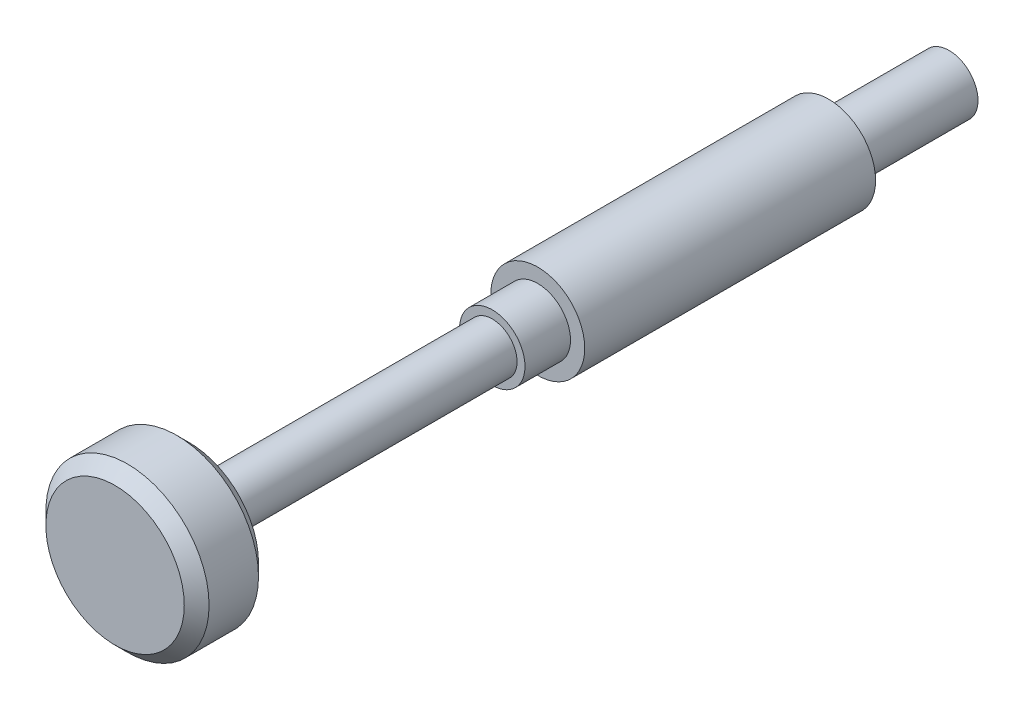
ISO-10303-21;
HEADER;
FILE_DESCRIPTION(('STEP AP214'),'2;1');
FILE_NAME('part.step','',(''),(''),'','','');
FILE_SCHEMA(('AUTOMOTIVE_DESIGN { 1 0 10303 214 1 1 1 1 }'));
ENDSEC;
DATA;
#1=APPLICATION_CONTEXT('core data for automotive mechanical design processes');
#2=APPLICATION_PROTOCOL_DEFINITION('international standard','automotive_design',2000,#1);
#3=PRODUCT_CONTEXT('',#1,'mechanical');
#4=PRODUCT('Part','Part','',(#3));
#5=PRODUCT_RELATED_PRODUCT_CATEGORY('part','',(#4));
#6=PRODUCT_DEFINITION_FORMATION('','',#4);
#7=PRODUCT_DEFINITION_CONTEXT('part definition',#1,'design');
#8=PRODUCT_DEFINITION('design','',#6,#7);
#9=PRODUCT_DEFINITION_SHAPE('','',#8);
#10=(LENGTH_UNIT() NAMED_UNIT(*) SI_UNIT(.MILLI.,.METRE.));
#11=(NAMED_UNIT(*) PLANE_ANGLE_UNIT() SI_UNIT($,.RADIAN.));
#12=(NAMED_UNIT(*) SI_UNIT($,.STERADIAN.) SOLID_ANGLE_UNIT());
#13=UNCERTAINTY_MEASURE_WITH_UNIT(LENGTH_MEASURE(1.E-05),#10,'distance_accuracy_value','');
#14=(GEOMETRIC_REPRESENTATION_CONTEXT(3) GLOBAL_UNCERTAINTY_ASSIGNED_CONTEXT((#13)) GLOBAL_UNIT_ASSIGNED_CONTEXT((#10,
#11,#12)) REPRESENTATION_CONTEXT('',''));
#15=CARTESIAN_POINT('',(0.,0.,0.));
#16=DIRECTION('',(0.,0.,1.));
#17=DIRECTION('',(1.,0.,0.));
#18=AXIS2_PLACEMENT_3D('',#15,#16,#17);
#19=CARTESIAN_POINT('',(0.,0.,14.55));
#20=DIRECTION('',(0.,0.,-1.));
#21=DIRECTION('',(-1.,0.,0.));
#22=AXIS2_PLACEMENT_3D('',#19,#20,#21);
#23=CYLINDRICAL_SURFACE('',#22,3.5);
#24=CARTESIAN_POINT('',(0.,0.,14.55));
#25=DIRECTION('',(0.,0.,1.));
#26=DIRECTION('',(1.,0.,0.));
#27=AXIS2_PLACEMENT_3D('',#24,#25,#26);
#28=CIRCLE('',#27,3.5);
#29=CARTESIAN_POINT('',(3.5,0.,14.55));
#30=VERTEX_POINT('',#29);
#31=EDGE_CURVE('E63',#30,#30,#28,.T.);
#32=ORIENTED_EDGE('',*,*,#31,.F.);
#33=EDGE_LOOP('',(#32));
#34=FACE_BOUND('',#33,.T.);
#35=CARTESIAN_POINT('',(0.,0.,0.));
#36=DIRECTION('',(0.,0.,1.));
#37=DIRECTION('',(1.,0.,0.));
#38=AXIS2_PLACEMENT_3D('',#35,#36,#37);
#39=CIRCLE('',#38,3.5);
#40=CARTESIAN_POINT('',(3.5,0.,0.));
#41=VERTEX_POINT('',#40);
#42=EDGE_CURVE('E60',#41,#41,#39,.T.);
#43=ORIENTED_EDGE('',*,*,#42,.T.);
#44=EDGE_LOOP('',(#43));
#45=FACE_BOUND('',#44,.T.);
#46=ADVANCED_FACE('F35',(#34,#45),#23,.T.);
#47=CARTESIAN_POINT('',(0.,0.,0.));
#48=DIRECTION('',(0.,0.,1.));
#49=DIRECTION('',(1.,0.,0.));
#50=AXIS2_PLACEMENT_3D('',#47,#48,#49);
#51=PLANE('',#50);
#52=ORIENTED_EDGE('',*,*,#42,.F.);
#53=EDGE_LOOP('',(#52));
#54=FACE_BOUND('',#53,.T.);
#55=ADVANCED_FACE('F115',(#54),#51,.F.);
#56=CARTESIAN_POINT('',(0.,0.,49.69));
#57=DIRECTION('',(0.,0.,-1.));
#58=DIRECTION('',(-1.,0.,0.));
#59=AXIS2_PLACEMENT_3D('',#56,#57,#58);
#60=CYLINDRICAL_SURFACE('',#59,5.675);
#61=CARTESIAN_POINT('',(0.,0.,49.69));
#62=DIRECTION('',(0.,0.,1.));
#63=DIRECTION('',(1.,0.,0.));
#64=AXIS2_PLACEMENT_3D('',#61,#62,#63);
#65=CIRCLE('',#64,5.675);
#66=CARTESIAN_POINT('',(5.675,0.,49.69));
#67=VERTEX_POINT('',#66);
#68=EDGE_CURVE('E64',#67,#67,#65,.T.);
#69=ORIENTED_EDGE('',*,*,#68,.F.);
#70=EDGE_LOOP('',(#69));
#71=FACE_BOUND('',#70,.T.);
#72=CARTESIAN_POINT('',(0.,0.,14.55));
#73=DIRECTION('',(0.,0.,1.));
#74=DIRECTION('',(1.,0.,0.));
#75=AXIS2_PLACEMENT_3D('',#72,#73,#74);
#76=CIRCLE('',#75,5.675);
#77=CARTESIAN_POINT('',(5.675,0.,14.55));
#78=VERTEX_POINT('',#77);
#79=EDGE_CURVE('E68',#78,#78,#76,.T.);
#80=ORIENTED_EDGE('',*,*,#79,.T.);
#81=EDGE_LOOP('',(#80));
#82=FACE_BOUND('',#81,.T.);
#83=ADVANCED_FACE('F109',(#71,#82),#60,.T.);
#84=CARTESIAN_POINT('',(0.,0.,49.69));
#85=DIRECTION('',(0.,0.,1.));
#86=DIRECTION('',(1.,0.,0.));
#87=AXIS2_PLACEMENT_3D('',#84,#85,#86);
#88=PLANE('',#87);
#89=CARTESIAN_POINT('',(0.,0.,49.69));
#90=DIRECTION('',(0.,0.,1.));
#91=DIRECTION('',(1.,0.,0.));
#92=AXIS2_PLACEMENT_3D('',#89,#90,#91);
#93=CIRCLE('',#92,3.955);
#94=CARTESIAN_POINT('',(3.955,0.,49.69));
#95=VERTEX_POINT('',#94);
#96=EDGE_CURVE('E67',#95,#95,#93,.T.);
#97=ORIENTED_EDGE('',*,*,#96,.F.);
#98=EDGE_LOOP('',(#97));
#99=FACE_BOUND('',#98,.T.);
#100=ORIENTED_EDGE('',*,*,#68,.T.);
#101=EDGE_LOOP('',(#100));
#102=FACE_BOUND('',#101,.T.);
#103=ADVANCED_FACE('F106',(#99,#102),#88,.T.);
#104=CARTESIAN_POINT('',(0.,0.,14.55));
#105=DIRECTION('',(0.,0.,1.));
#106=DIRECTION('',(1.,0.,0.));
#107=AXIS2_PLACEMENT_3D('',#104,#105,#106);
#108=PLANE('',#107);
#109=ORIENTED_EDGE('',*,*,#31,.T.);
#110=EDGE_LOOP('',(#109));
#111=FACE_BOUND('',#110,.T.);
#112=ORIENTED_EDGE('',*,*,#79,.F.);
#113=EDGE_LOOP('',(#112));
#114=FACE_BOUND('',#113,.T.);
#115=ADVANCED_FACE('F102',(#111,#114),#108,.F.);
#116=CARTESIAN_POINT('',(0.,0.,55.19));
#117=DIRECTION('',(0.,0.,-1.));
#118=DIRECTION('',(-1.,0.,0.));
#119=AXIS2_PLACEMENT_3D('',#116,#117,#118);
#120=CYLINDRICAL_SURFACE('',#119,3.955);
#121=CARTESIAN_POINT('',(0.,0.,55.19));
#122=DIRECTION('',(0.,0.,1.));
#123=DIRECTION('',(1.,0.,0.));
#124=AXIS2_PLACEMENT_3D('',#121,#122,#123);
#125=CIRCLE('',#124,3.955);
#126=CARTESIAN_POINT('',(3.955,0.,55.19));
#127=VERTEX_POINT('',#126);
#128=EDGE_CURVE('E71',#127,#127,#125,.T.);
#129=ORIENTED_EDGE('',*,*,#128,.F.);
#130=EDGE_LOOP('',(#129));
#131=FACE_BOUND('',#130,.T.);
#132=ORIENTED_EDGE('',*,*,#96,.T.);
#133=EDGE_LOOP('',(#132));
#134=FACE_BOUND('',#133,.T.);
#135=ADVANCED_FACE('F96',(#131,#134),#120,.T.);
#136=CARTESIAN_POINT('',(0.,0.,55.19));
#137=DIRECTION('',(0.,0.,1.));
#138=DIRECTION('',(1.,0.,0.));
#139=AXIS2_PLACEMENT_3D('',#136,#137,#138);
#140=PLANE('',#139);
#141=CARTESIAN_POINT('',(0.,0.,55.19));
#142=DIRECTION('',(0.,0.,1.));
#143=DIRECTION('',(1.,0.,0.));
#144=AXIS2_PLACEMENT_3D('',#141,#142,#143);
#145=CIRCLE('',#144,3.);
#146=CARTESIAN_POINT('',(3.,0.,55.19));
#147=VERTEX_POINT('',#146);
#148=EDGE_CURVE('E59',#147,#147,#145,.T.);
#149=ORIENTED_EDGE('',*,*,#148,.F.);
#150=EDGE_LOOP('',(#149));
#151=FACE_BOUND('',#150,.T.);
#152=ORIENTED_EDGE('',*,*,#128,.T.);
#153=EDGE_LOOP('',(#152));
#154=FACE_BOUND('',#153,.T.);
#155=ADVANCED_FACE('F90',(#151,#154),#140,.T.);
#156=CARTESIAN_POINT('',(0.,0.,91.79));
#157=DIRECTION('',(0.,0.,-1.));
#158=DIRECTION('',(-1.,0.,0.));
#159=AXIS2_PLACEMENT_3D('',#156,#157,#158);
#160=CYLINDRICAL_SURFACE('',#159,3.);
#161=CARTESIAN_POINT('',(0.,0.,91.79));
#162=DIRECTION('',(0.,0.,1.));
#163=DIRECTION('',(1.,0.,0.));
#164=AXIS2_PLACEMENT_3D('',#161,#162,#163);
#165=CIRCLE('',#164,3.);
#166=CARTESIAN_POINT('',(3.,0.,91.79));
#167=VERTEX_POINT('',#166);
#168=EDGE_CURVE('E78',#167,#167,#165,.T.);
#169=ORIENTED_EDGE('',*,*,#168,.F.);
#170=EDGE_LOOP('',(#169));
#171=FACE_BOUND('',#170,.T.);
#172=ORIENTED_EDGE('',*,*,#148,.T.);
#173=EDGE_LOOP('',(#172));
#174=FACE_BOUND('',#173,.T.);
#175=ADVANCED_FACE('F86',(#171,#174),#160,.T.);
#176=CARTESIAN_POINT('',(0.,0.,229.408291449997));
#177=DIRECTION('',(0.,0.,-1.));
#178=DIRECTION('',(-1.,0.,0.));
#179=AXIS2_PLACEMENT_3D('',#176,#177,#178);
#180=CYLINDRICAL_SURFACE('',#179,9.86);
#181=CARTESIAN_POINT('',(0.,0.,99.26));
#182=DIRECTION('',(0.,0.,1.));
#183=DIRECTION('',(1.,0.,0.));
#184=AXIS2_PLACEMENT_3D('',#181,#182,#183);
#185=CIRCLE('',#184,9.86);
#186=CARTESIAN_POINT('',(9.86,0.,99.26));
#187=VERTEX_POINT('',#186);
#188=EDGE_CURVE('E43',#187,#187,#185,.F.);
#189=ORIENTED_EDGE('',*,*,#188,.T.);
#190=EDGE_LOOP('',(#189));
#191=FACE_BOUND('',#190,.T.);
#192=CARTESIAN_POINT('',(0.,0.,93.29));
#193=DIRECTION('',(0.,0.,1.));
#194=DIRECTION('',(1.,0.,0.));
#195=AXIS2_PLACEMENT_3D('',#192,#193,#194);
#196=CIRCLE('',#195,9.86);
#197=CARTESIAN_POINT('',(9.86,0.,93.29));
#198=VERTEX_POINT('',#197);
#199=EDGE_CURVE('E50',#198,#198,#196,.T.);
#200=ORIENTED_EDGE('',*,*,#199,.T.);
#201=EDGE_LOOP('',(#200));
#202=FACE_BOUND('',#201,.T.);
#203=ADVANCED_FACE('F89',(#191,#202),#180,.T.);
#204=CARTESIAN_POINT('',(0.,0.,91.79));
#205=DIRECTION('',(0.,0.,1.));
#206=DIRECTION('',(1.,0.,0.));
#207=AXIS2_PLACEMENT_3D('',#204,#205,#206);
#208=PLANE('',#207);
#209=CARTESIAN_POINT('',(0.,0.,91.79));
#210=DIRECTION('',(0.,0.,1.));
#211=DIRECTION('',(1.,0.,0.));
#212=AXIS2_PLACEMENT_3D('',#209,#210,#211);
#213=CIRCLE('',#212,8.36000000000002);
#214=CARTESIAN_POINT('',(8.36000000000002,0.,91.79));
#215=VERTEX_POINT('',#214);
#216=EDGE_CURVE('E11',#215,#215,#213,.F.);
#217=ORIENTED_EDGE('',*,*,#216,.T.);
#218=EDGE_LOOP('',(#217));
#219=FACE_BOUND('',#218,.T.);
#220=ORIENTED_EDGE('',*,*,#168,.T.);
#221=EDGE_LOOP('',(#220));
#222=FACE_BOUND('',#221,.T.);
#223=ADVANCED_FACE('F84',(#219,#222),#208,.F.);
#224=CARTESIAN_POINT('',(0.,0.,100.76));
#225=DIRECTION('',(0.,0.,1.));
#226=DIRECTION('',(1.,0.,0.));
#227=AXIS2_PLACEMENT_3D('',#224,#225,#226);
#228=PLANE('',#227);
#229=CARTESIAN_POINT('',(0.,0.,100.76));
#230=DIRECTION('',(0.,0.,1.));
#231=DIRECTION('',(1.,0.,0.));
#232=AXIS2_PLACEMENT_3D('',#229,#230,#231);
#233=CIRCLE('',#232,8.36000000000001);
#234=CARTESIAN_POINT('',(8.36000000000001,0.,100.76));
#235=VERTEX_POINT('',#234);
#236=EDGE_CURVE('E54',#235,#235,#233,.T.);
#237=ORIENTED_EDGE('',*,*,#236,.T.);
#238=EDGE_LOOP('',(#237));
#239=FACE_BOUND('',#238,.T.);
#240=ADVANCED_FACE('F136',(#239),#228,.T.);
#241=CARTESIAN_POINT('',(0.,0.,100.76));
#242=DIRECTION('',(0.,0.,-1.));
#243=DIRECTION('',(-1.,0.,0.));
#244=AXIS2_PLACEMENT_3D('',#241,#242,#243);
#245=CONICAL_SURFACE('',#244,8.35999999999999,0.785398163397441);
#246=ORIENTED_EDGE('',*,*,#188,.F.);
#247=EDGE_LOOP('',(#246));
#248=FACE_BOUND('',#247,.T.);
#249=ORIENTED_EDGE('',*,*,#236,.F.);
#250=EDGE_LOOP('',(#249));
#251=FACE_BOUND('',#250,.T.);
#252=ADVANCED_FACE('F134',(#248,#251),#245,.T.);
#253=CARTESIAN_POINT('',(0.,0.,93.29));
#254=DIRECTION('',(0.,0.,1.));
#255=DIRECTION('',(1.,0.,0.));
#256=AXIS2_PLACEMENT_3D('',#253,#254,#255);
#257=CONICAL_SURFACE('',#256,9.86,0.785398163397446);
#258=ORIENTED_EDGE('',*,*,#216,.F.);
#259=EDGE_LOOP('',(#258));
#260=FACE_BOUND('',#259,.T.);
#261=ORIENTED_EDGE('',*,*,#199,.F.);
#262=EDGE_LOOP('',(#261));
#263=FACE_BOUND('',#262,.T.);
#264=ADVANCED_FACE('F37',(#260,#263),#257,.T.);
#265=CLOSED_SHELL('',(#46,#55,#83,#103,#115,#135,#155,#175,#203,#223,#240,#252,#264));
#266=MANIFOLD_SOLID_BREP('B2',#265);
#267=ADVANCED_BREP_SHAPE_REPRESENTATION('',(#18,#266),#14);
#268=SHAPE_DEFINITION_REPRESENTATION(#9,#267);
ENDSEC;
END-ISO-10303-21;
